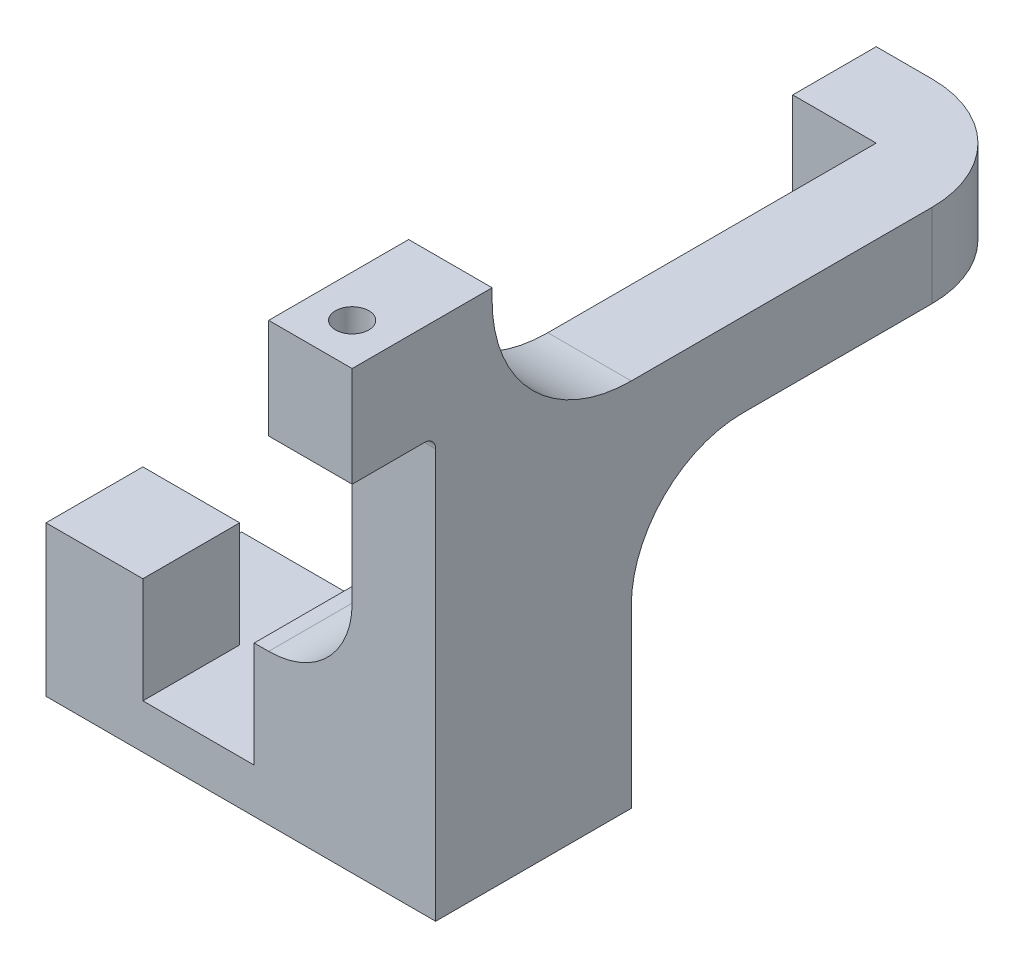
ISO-10303-21;
HEADER;
FILE_DESCRIPTION(('STEP AP214'),'2;1');
FILE_NAME('part.step','',(''),(''),'','','');
FILE_SCHEMA(('AUTOMOTIVE_DESIGN { 1 0 10303 214 1 1 1 1 }'));
ENDSEC;
DATA;
#1=APPLICATION_CONTEXT('core data for automotive mechanical design processes');
#2=APPLICATION_PROTOCOL_DEFINITION('international standard','automotive_design',2000,#1);
#3=PRODUCT_CONTEXT('',#1,'mechanical');
#4=PRODUCT('Part','Part','',(#3));
#5=PRODUCT_RELATED_PRODUCT_CATEGORY('part','',(#4));
#6=PRODUCT_DEFINITION_FORMATION('','',#4);
#7=PRODUCT_DEFINITION_CONTEXT('part definition',#1,'design');
#8=PRODUCT_DEFINITION('design','',#6,#7);
#9=PRODUCT_DEFINITION_SHAPE('','',#8);
#10=(LENGTH_UNIT() NAMED_UNIT(*) SI_UNIT(.MILLI.,.METRE.));
#11=(NAMED_UNIT(*) PLANE_ANGLE_UNIT() SI_UNIT($,.RADIAN.));
#12=(NAMED_UNIT(*) SI_UNIT($,.STERADIAN.) SOLID_ANGLE_UNIT());
#13=UNCERTAINTY_MEASURE_WITH_UNIT(LENGTH_MEASURE(1.E-05),#10,'distance_accuracy_value','');
#14=(GEOMETRIC_REPRESENTATION_CONTEXT(3) GLOBAL_UNCERTAINTY_ASSIGNED_CONTEXT((#13)) GLOBAL_UNIT_ASSIGNED_CONTEXT((#10,
#11,#12)) REPRESENTATION_CONTEXT('',''));
#15=CARTESIAN_POINT('',(0.,0.,0.));
#16=DIRECTION('',(0.,0.,1.));
#17=DIRECTION('',(1.,0.,0.));
#18=AXIS2_PLACEMENT_3D('',#15,#16,#17);
#19=CARTESIAN_POINT('',(-72.925,40.,45.0524601018634));
#20=DIRECTION('',(0.,0.,1.));
#21=DIRECTION('',(1.,0.,0.));
#22=AXIS2_PLACEMENT_3D('',#19,#20,#21);
#23=CYLINDRICAL_SURFACE('',#22,7.5);
#24=CARTESIAN_POINT('',(-65.425,40.,61.1360222652746));
#25=CARTESIAN_POINT('',(-65.4249772438871,39.8445221092474,61.2319668318376));
#26=CARTESIAN_POINT('',(-65.4298346400299,39.686339067759,61.3236216924118));
#27=CARTESIAN_POINT('',(-65.4501528101208,39.3656502932931,61.4979319972819));
#28=CARTESIAN_POINT('',(-65.4656192459043,39.2031422967066,61.5805826088811));
#29=CARTESIAN_POINT('',(-65.5079324331207,38.8755858491255,61.7361111529009));
#30=CARTESIAN_POINT('',(-65.5347425315859,38.7105472158723,61.8090195740209));
#31=CARTESIAN_POINT('',(-65.600351000794,38.3788638985895,61.9450567051029));
#32=CARTESIAN_POINT('',(-65.6391467735014,38.2122195701897,62.0081875300256));
#33=CARTESIAN_POINT('',(-65.7293371098939,37.8780884322385,62.1248164960973));
#34=CARTESIAN_POINT('',(-65.7807860976065,37.710601128866,62.1782712469318));
#35=CARTESIAN_POINT('',(-65.8963667348753,37.3771281979921,62.2753034455721));
#36=CARTESIAN_POINT('',(-65.960499551139,37.2111427101034,62.3188799839498));
#37=CARTESIAN_POINT('',(-66.1013869419035,36.8822570897864,62.3964912759389));
#38=CARTESIAN_POINT('',(-66.1781460783117,36.7193580963232,62.4305225687733));
#39=CARTESIAN_POINT('',(-66.3439519124394,36.398271088903,62.4895755265165));
#40=CARTESIAN_POINT('',(-66.4329976393504,36.2400827039432,62.5145979026893));
#41=CARTESIAN_POINT('',(-66.6194094708557,35.9354901653982,62.5556276731751));
#42=CARTESIAN_POINT('',(-66.7163532082868,35.7888666331716,62.5719307987366));
#43=CARTESIAN_POINT('',(-66.9206277090854,35.5023926490622,62.5976924454485));
#44=CARTESIAN_POINT('',(-67.0279597461105,35.3625430308571,62.6071501261048));
#45=CARTESIAN_POINT('',(-67.2524721214189,35.0904630322989,62.6201314573047));
#46=CARTESIAN_POINT('',(-67.3696627813558,34.9582408879846,62.6236488052606));
#47=CARTESIAN_POINT('',(-67.6130510302732,34.7024123799341,62.6257059483882));
#48=CARTESIAN_POINT('',(-67.7392451816666,34.5788027631369,62.6242476334456));
#49=CARTESIAN_POINT('',(-67.8696144573129,34.4598666970198,62.6207902472241));
#50=B_SPLINE_CURVE_WITH_KNOTS('',3,(#24,#25,#26,#27,#28,#29,#30,#31,#32,#33,#34,#35,#36,#37,#38,
#39,#40,#41,#42,#43,#44,#45,#46,#47,#48,#49),.UNSPECIFIED.,.F.,.F.,(4,2,2,2,2,2,2,2,2,2,2,2,4),
(0.,0.548035113739724,1.09636293080322,1.64293239307999,2.18938346304048,2.73822734665108,
3.28712173854301,3.83621488411844,4.38526466865447,4.91427257243661,5.44334541759769,
5.97297924784439,6.50241193184123),.UNSPECIFIED.);
#51=CARTESIAN_POINT('',(-67.5689286785929,34.75,62.625));
#52=VERTEX_POINT('',#51);
#53=CARTESIAN_POINT('',(-65.425,40.,61.1360222652746));
#54=VERTEX_POINT('',#53);
#55=EDGE_CURVE('E435',#52,#54,#50,.F.);
#56=ORIENTED_EDGE('',*,*,#55,.F.);
#57=CARTESIAN_POINT('',(-72.925,40.,62.625));
#58=DIRECTION('',(0.,0.,1.));
#59=DIRECTION('',(1.,0.,0.));
#60=AXIS2_PLACEMENT_3D('',#57,#58,#59);
#61=CIRCLE('',#60,7.5);
#62=CARTESIAN_POINT('',(-72.925,32.5,62.625));
#63=VERTEX_POINT('',#62);
#64=EDGE_CURVE('E67',#52,#63,#61,.F.);
#65=ORIENTED_EDGE('',*,*,#64,.T.);
#66=DIRECTION('',(0.,0.,1.));
#67=VECTOR('',#66,1.);
#68=CARTESIAN_POINT('',(-72.925,32.5,66.4975398981366));
#69=LINE('',#68,#67);
#70=CARTESIAN_POINT('',(-72.925,32.5,80.1975398981366));
#71=VERTEX_POINT('',#70);
#72=EDGE_CURVE('E433',#71,#63,#69,.F.);
#73=ORIENTED_EDGE('',*,*,#72,.F.);
#74=CARTESIAN_POINT('',(-72.925,40.,80.1975398981366));
#75=DIRECTION('',(0.,0.,1.));
#76=DIRECTION('',(1.,0.,0.));
#77=AXIS2_PLACEMENT_3D('',#74,#75,#76);
#78=CIRCLE('',#77,7.5);
#79=CARTESIAN_POINT('',(-65.425,40.,80.1975398981366));
#80=VERTEX_POINT('',#79);
#81=EDGE_CURVE('E12',#71,#80,#78,.T.);
#82=ORIENTED_EDGE('',*,*,#81,.T.);
#83=DIRECTION('',(0.,0.,1.));
#84=VECTOR('',#83,1.);
#85=CARTESIAN_POINT('',(-65.425,40.,45.0524601018634));
#86=LINE('',#85,#84);
#87=EDGE_CURVE('E430',#54,#80,#86,.T.);
#88=ORIENTED_EDGE('',*,*,#87,.F.);
#89=EDGE_LOOP('',(#56,#65,#73,#82,#88));
#90=FACE_BOUND('',#89,.T.);
#91=ADVANCED_FACE('F59',(#90),#23,.F.);
#92=CARTESIAN_POINT('',(0.,55.75,81.1975398981366));
#93=DIRECTION('',(-1.,0.,0.));
#94=DIRECTION('',(0.,0.,1.));
#95=AXIS2_PLACEMENT_3D('',#92,#93,#94);
#96=CYLINDRICAL_SURFACE('',#95,1.);
#97=DIRECTION('',(1.,0.,0.));
#98=VECTOR('',#97,1.);
#99=CARTESIAN_POINT('',(0.,56.75,81.1975398981366));
#100=LINE('',#99,#98);
#101=CARTESIAN_POINT('',(-65.425,56.75,81.1975398981366));
#102=VERTEX_POINT('',#101);
#103=CARTESIAN_POINT('',(-57.925,56.75,81.1975398981366));
#104=VERTEX_POINT('',#103);
#105=EDGE_CURVE('E235',#102,#104,#100,.T.);
#106=ORIENTED_EDGE('',*,*,#105,.F.);
#107=CARTESIAN_POINT('',(-65.425,55.75,81.1975398981366));
#108=DIRECTION('',(-1.,0.,0.));
#109=DIRECTION('',(0.,0.,1.));
#110=AXIS2_PLACEMENT_3D('',#107,#108,#109);
#111=CIRCLE('',#110,1.);
#112=CARTESIAN_POINT('',(-65.425,55.75,80.1975398981366));
#113=VERTEX_POINT('',#112);
#114=EDGE_CURVE('E425',#102,#113,#111,.T.);
#115=ORIENTED_EDGE('',*,*,#114,.T.);
#116=DIRECTION('',(1.,0.,0.));
#117=VECTOR('',#116,1.);
#118=CARTESIAN_POINT('',(0.,55.75,80.1975398981366));
#119=LINE('',#118,#117);
#120=CARTESIAN_POINT('',(-57.925,55.75,80.1975398981366));
#121=VERTEX_POINT('',#120);
#122=EDGE_CURVE('E422',#121,#113,#119,.F.);
#123=ORIENTED_EDGE('',*,*,#122,.F.);
#124=CARTESIAN_POINT('',(-57.925,55.75,81.1975398981366));
#125=DIRECTION('',(-1.,0.,0.));
#126=DIRECTION('',(0.,0.,1.));
#127=AXIS2_PLACEMENT_3D('',#124,#125,#126);
#128=CIRCLE('',#127,1.);
#129=EDGE_CURVE('E428',#121,#104,#128,.F.);
#130=ORIENTED_EDGE('',*,*,#129,.T.);
#131=EDGE_LOOP('',(#106,#115,#123,#130));
#132=FACE_BOUND('',#131,.T.);
#133=ADVANCED_FACE('F450',(#132),#96,.F.);
#134=CARTESIAN_POINT('',(-67.925,-35.9364248901641,35.625));
#135=DIRECTION('',(0.,-1.,0.));
#136=DIRECTION('',(0.,0.,-1.));
#137=AXIS2_PLACEMENT_3D('',#134,#135,#136);
#138=CYLINDRICAL_SURFACE('',#137,10.);
#139=DIRECTION('',(0.,1.,0.));
#140=VECTOR('',#139,1.);
#141=CARTESIAN_POINT('',(-57.925,-35.9364248901641,35.625));
#142=LINE('',#141,#140);
#143=CARTESIAN_POINT('',(-57.925,44.75,35.625));
#144=VERTEX_POINT('',#143);
#145=CARTESIAN_POINT('',(-57.925,52.25,35.625));
#146=VERTEX_POINT('',#145);
#147=EDGE_CURVE('E411',#144,#146,#142,.T.);
#148=ORIENTED_EDGE('',*,*,#147,.F.);
#149=CARTESIAN_POINT('',(-67.925,44.75,35.625));
#150=DIRECTION('',(0.,1.,0.));
#151=DIRECTION('',(0.,0.,1.));
#152=AXIS2_PLACEMENT_3D('',#149,#150,#151);
#153=CIRCLE('',#152,10.);
#154=CARTESIAN_POINT('',(-67.925,44.75,25.625));
#155=VERTEX_POINT('',#154);
#156=EDGE_CURVE('E417',#155,#144,#153,.F.);
#157=ORIENTED_EDGE('',*,*,#156,.F.);
#158=DIRECTION('',(0.,1.,0.));
#159=VECTOR('',#158,1.);
#160=CARTESIAN_POINT('',(-67.925,-35.9364248901641,25.625));
#161=LINE('',#160,#159);
#162=CARTESIAN_POINT('',(-67.925,52.25,25.625));
#163=VERTEX_POINT('',#162);
#164=EDGE_CURVE('E414',#163,#155,#161,.F.);
#165=ORIENTED_EDGE('',*,*,#164,.F.);
#166=CARTESIAN_POINT('',(-67.925,52.25,35.625));
#167=DIRECTION('',(0.,-1.,0.));
#168=DIRECTION('',(0.,0.,-1.));
#169=AXIS2_PLACEMENT_3D('',#166,#167,#168);
#170=CIRCLE('',#169,10.);
#171=EDGE_CURVE('E419',#146,#163,#170,.F.);
#172=ORIENTED_EDGE('',*,*,#171,.F.);
#173=EDGE_LOOP('',(#148,#157,#165,#172));
#174=FACE_BOUND('',#173,.T.);
#175=ADVANCED_FACE('F447',(#174),#138,.T.);
#176=CARTESIAN_POINT('',(0.,34.75,52.625));
#177=DIRECTION('',(-1.,0.,0.));
#178=DIRECTION('',(0.,0.,1.));
#179=AXIS2_PLACEMENT_3D('',#176,#177,#178);
#180=CYLINDRICAL_SURFACE('',#179,10.);
#181=DIRECTION('',(1.,0.,0.));
#182=VECTOR('',#181,1.);
#183=CARTESIAN_POINT('',(0.,34.75,62.625));
#184=LINE('',#183,#182);
#185=CARTESIAN_POINT('',(-57.925,34.75,62.625));
#186=VERTEX_POINT('',#185);
#187=EDGE_CURVE('E74',#52,#186,#184,.T.);
#188=ORIENTED_EDGE('',*,*,#187,.F.);
#189=ORIENTED_EDGE('',*,*,#55,.T.);
#190=CARTESIAN_POINT('',(-65.425,34.75,52.625));
#191=DIRECTION('',(-1.,0.,0.));
#192=DIRECTION('',(0.,0.,1.));
#193=AXIS2_PLACEMENT_3D('',#190,#191,#192);
#194=CIRCLE('',#193,10.);
#195=CARTESIAN_POINT('',(-65.425,44.75,52.625));
#196=VERTEX_POINT('',#195);
#197=EDGE_CURVE('E407',#54,#196,#194,.T.);
#198=ORIENTED_EDGE('',*,*,#197,.T.);
#199=DIRECTION('',(1.,0.,0.));
#200=VECTOR('',#199,1.);
#201=CARTESIAN_POINT('',(0.,44.75,52.625));
#202=LINE('',#201,#200);
#203=CARTESIAN_POINT('',(-57.925,44.75,52.625));
#204=VERTEX_POINT('',#203);
#205=EDGE_CURVE('E404',#204,#196,#202,.F.);
#206=ORIENTED_EDGE('',*,*,#205,.F.);
#207=CARTESIAN_POINT('',(-57.925,34.75,52.625));
#208=DIRECTION('',(-1.,0.,0.));
#209=DIRECTION('',(0.,0.,1.));
#210=AXIS2_PLACEMENT_3D('',#207,#208,#209);
#211=CIRCLE('',#210,10.);
#212=EDGE_CURVE('E409',#204,#186,#211,.F.);
#213=ORIENTED_EDGE('',*,*,#212,.T.);
#214=EDGE_LOOP('',(#188,#189,#198,#206,#213));
#215=FACE_BOUND('',#214,.T.);
#216=ADVANCED_FACE('F441',(#215),#180,.F.);
#217=CARTESIAN_POINT('',(0.,0.,62.625));
#218=DIRECTION('',(0.,0.,1.));
#219=DIRECTION('',(1.,0.,0.));
#220=AXIS2_PLACEMENT_3D('',#217,#218,#219);
#221=PLANE('',#220);
#222=ORIENTED_EDGE('',*,*,#64,.F.);
#223=ORIENTED_EDGE('',*,*,#187,.T.);
#224=DIRECTION('',(0.,1.,0.));
#225=VECTOR('',#224,1.);
#226=CARTESIAN_POINT('',(-57.925,-35.9364248901641,62.625));
#227=LINE('',#226,#225);
#228=CARTESIAN_POINT('',(-57.925,19.,62.625));
#229=VERTEX_POINT('',#228);
#230=EDGE_CURVE('E339',#229,#186,#227,.T.);
#231=ORIENTED_EDGE('',*,*,#230,.F.);
#232=DIRECTION('',(1.,0.,0.));
#233=VECTOR('',#232,1.);
#234=CARTESIAN_POINT('',(-92.925,19.,62.625));
#235=LINE('',#234,#233);
#236=CARTESIAN_POINT('',(-92.925,19.,62.625));
#237=VERTEX_POINT('',#236);
#238=EDGE_CURVE('E336',#237,#229,#235,.T.);
#239=ORIENTED_EDGE('',*,*,#238,.F.);
#240=DIRECTION('',(0.,-1.,0.));
#241=VECTOR('',#240,1.);
#242=CARTESIAN_POINT('',(-92.925,0.,62.625));
#243=LINE('',#242,#241);
#244=CARTESIAN_POINT('',(-92.925,23.,62.625));
#245=VERTEX_POINT('',#244);
#246=EDGE_CURVE('E333',#245,#237,#243,.T.);
#247=ORIENTED_EDGE('',*,*,#246,.F.);
#248=DIRECTION('',(1.,0.,0.));
#249=VECTOR('',#248,1.);
#250=CARTESIAN_POINT('',(0.,23.,62.625));
#251=LINE('',#250,#249);
#252=CARTESIAN_POINT('',(-76.062179306799,23.,62.625));
#253=VERTEX_POINT('',#252);
#254=EDGE_CURVE('E331',#245,#253,#251,.T.);
#255=ORIENTED_EDGE('',*,*,#254,.T.);
#256=DIRECTION('',(0.,1.,0.));
#257=VECTOR('',#256,1.);
#258=CARTESIAN_POINT('',(-76.062179306799,23.,62.625));
#259=LINE('',#258,#257);
#260=CARTESIAN_POINT('',(-76.062179306799,32.5,62.625));
#261=VERTEX_POINT('',#260);
#262=EDGE_CURVE('E398',#261,#253,#259,.F.);
#263=ORIENTED_EDGE('',*,*,#262,.F.);
#264=DIRECTION('',(-1.,0.,0.));
#265=VECTOR('',#264,1.);
#266=CARTESIAN_POINT('',(-65.525,32.5,62.625));
#267=LINE('',#266,#265);
#268=EDGE_CURVE('E329',#63,#261,#267,.T.);
#269=ORIENTED_EDGE('',*,*,#268,.F.);
#270=EDGE_LOOP('',(#222,#223,#231,#239,#247,#255,#263,#269));
#271=FACE_BOUND('',#270,.T.);
#272=ADVANCED_FACE('F446',(#271),#221,.F.);
#273=CARTESIAN_POINT('',(-65.425,-35.9364248901641,45.0524601018634));
#274=DIRECTION('',(-1.,0.,0.));
#275=DIRECTION('',(0.,0.,1.));
#276=AXIS2_PLACEMENT_3D('',#273,#274,#275);
#277=PLANE('',#276);
#278=ORIENTED_EDGE('',*,*,#197,.F.);
#279=ORIENTED_EDGE('',*,*,#87,.T.);
#280=DIRECTION('',(0.,1.,0.));
#281=VECTOR('',#280,1.);
#282=CARTESIAN_POINT('',(-65.425,-35.9364248901641,80.1975398981366));
#283=LINE('',#282,#281);
#284=EDGE_CURVE('E390',#80,#113,#283,.T.);
#285=ORIENTED_EDGE('',*,*,#284,.T.);
#286=ORIENTED_EDGE('',*,*,#114,.F.);
#287=DIRECTION('',(0.,0.,-1.));
#288=VECTOR('',#287,1.);
#289=CARTESIAN_POINT('',(-65.425,56.75,87.6975398981366));
#290=LINE('',#289,#288);
#291=CARTESIAN_POINT('',(-65.425,56.75,87.6975398981366));
#292=VERTEX_POINT('',#291);
#293=EDGE_CURVE('E237',#292,#102,#290,.T.);
#294=ORIENTED_EDGE('',*,*,#293,.F.);
#295=DIRECTION('',(0.,1.,0.));
#296=VECTOR('',#295,1.);
#297=CARTESIAN_POINT('',(-65.425,58.75,87.6975398981366));
#298=LINE('',#297,#296);
#299=CARTESIAN_POINT('',(-65.425,65.75,87.6975398981366));
#300=VERTEX_POINT('',#299);
#301=EDGE_CURVE('E249',#292,#300,#298,.T.);
#302=ORIENTED_EDGE('',*,*,#301,.T.);
#303=DIRECTION('',(0.,0.,1.));
#304=VECTOR('',#303,1.);
#305=CARTESIAN_POINT('',(-65.425,65.75,0.));
#306=LINE('',#305,#304);
#307=CARTESIAN_POINT('',(-65.425,65.75,75.125));
#308=VERTEX_POINT('',#307);
#309=EDGE_CURVE('E263',#308,#300,#306,.T.);
#310=ORIENTED_EDGE('',*,*,#309,.F.);
#311=DIRECTION('',(0.,-1.,0.));
#312=VECTOR('',#311,1.);
#313=CARTESIAN_POINT('',(-65.425,65.75,75.125));
#314=LINE('',#313,#312);
#315=CARTESIAN_POINT('',(-65.425,64.75,75.125));
#316=VERTEX_POINT('',#315);
#317=EDGE_CURVE('E266',#308,#316,#314,.T.);
#318=ORIENTED_EDGE('',*,*,#317,.T.);
#319=CARTESIAN_POINT('',(-65.425,64.75,62.625));
#320=DIRECTION('',(-1.,0.,0.));
#321=DIRECTION('',(0.,0.,1.));
#322=AXIS2_PLACEMENT_3D('',#319,#320,#321);
#323=CIRCLE('',#322,12.5);
#324=CARTESIAN_POINT('',(-65.425,52.25,62.625));
#325=VERTEX_POINT('',#324);
#326=EDGE_CURVE('E387',#316,#325,#323,.F.);
#327=ORIENTED_EDGE('',*,*,#326,.T.);
#328=DIRECTION('',(0.,0.,1.));
#329=VECTOR('',#328,1.);
#330=CARTESIAN_POINT('',(-65.425,52.25,33.125));
#331=LINE('',#330,#329);
#332=CARTESIAN_POINT('',(-65.425,52.25,33.125));
#333=VERTEX_POINT('',#332);
#334=EDGE_CURVE('E299',#333,#325,#331,.T.);
#335=ORIENTED_EDGE('',*,*,#334,.F.);
#336=DIRECTION('',(0.,1.,0.));
#337=VECTOR('',#336,1.);
#338=CARTESIAN_POINT('',(-65.425,0.,33.125));
#339=LINE('',#338,#337);
#340=CARTESIAN_POINT('',(-65.425,44.75,33.125));
#341=VERTEX_POINT('',#340);
#342=EDGE_CURVE('E287',#341,#333,#339,.T.);
#343=ORIENTED_EDGE('',*,*,#342,.F.);
#344=DIRECTION('',(0.,0.,1.));
#345=VECTOR('',#344,1.);
#346=CARTESIAN_POINT('',(-65.425,44.75,33.125));
#347=LINE('',#346,#345);
#348=EDGE_CURVE('E298',#341,#196,#347,.T.);
#349=ORIENTED_EDGE('',*,*,#348,.T.);
#350=EDGE_LOOP('',(#278,#279,#285,#286,#294,#302,#310,#318,#327,#335,#343,#349));
#351=FACE_BOUND('',#350,.T.);
#352=ADVANCED_FACE('F511',(#351),#277,.T.);
#353=CARTESIAN_POINT('',(-65.425,-35.9364248901641,80.1975398981366));
#354=DIRECTION('',(0.,0.,1.));
#355=DIRECTION('',(1.,0.,0.));
#356=AXIS2_PLACEMENT_3D('',#353,#354,#355);
#357=PLANE('',#356);
#358=DIRECTION('',(0.,1.,0.));
#359=VECTOR('',#358,1.);
#360=CARTESIAN_POINT('',(-57.925,-35.9364248901641,80.1975398981366));
#361=LINE('',#360,#359);
#362=CARTESIAN_POINT('',(-57.925,19.,80.1975398981366));
#363=VERTEX_POINT('',#362);
#364=EDGE_CURVE('E391',#363,#121,#361,.T.);
#365=ORIENTED_EDGE('',*,*,#364,.T.);
#366=ORIENTED_EDGE('',*,*,#122,.T.);
#367=ORIENTED_EDGE('',*,*,#284,.F.);
#368=ORIENTED_EDGE('',*,*,#81,.F.);
#369=DIRECTION('',(1.,0.,0.));
#370=VECTOR('',#369,1.);
#371=CARTESIAN_POINT('',(-74.225,32.5,80.1975398981366));
#372=LINE('',#371,#370);
#373=CARTESIAN_POINT('',(-74.225,32.5,80.1975398981366));
#374=VERTEX_POINT('',#373);
#375=EDGE_CURVE('E326',#374,#71,#372,.T.);
#376=ORIENTED_EDGE('',*,*,#375,.F.);
#377=DIRECTION('',(0.,1.,0.));
#378=VECTOR('',#377,1.);
#379=CARTESIAN_POINT('',(-74.225,23.,80.1975398981366));
#380=LINE('',#379,#378);
#381=CARTESIAN_POINT('',(-74.225,23.,80.1975398981366));
#382=VERTEX_POINT('',#381);
#383=EDGE_CURVE('E366',#382,#374,#380,.T.);
#384=ORIENTED_EDGE('',*,*,#383,.F.);
#385=DIRECTION('',(1.,0.,0.));
#386=VECTOR('',#385,1.);
#387=CARTESIAN_POINT('',(0.,23.,80.1975398981366));
#388=LINE('',#387,#386);
#389=CARTESIAN_POINT('',(-84.225,23.,80.1975398981366));
#390=VERTEX_POINT('',#389);
#391=EDGE_CURVE('E358',#390,#382,#388,.T.);
#392=ORIENTED_EDGE('',*,*,#391,.F.);
#393=DIRECTION('',(0.,1.,0.));
#394=VECTOR('',#393,1.);
#395=CARTESIAN_POINT('',(-84.225,23.,80.1975398981366));
#396=LINE('',#395,#394);
#397=CARTESIAN_POINT('',(-84.225,32.5,80.1975398981366));
#398=VERTEX_POINT('',#397);
#399=EDGE_CURVE('E368',#390,#398,#396,.T.);
#400=ORIENTED_EDGE('',*,*,#399,.T.);
#401=DIRECTION('',(1.,0.,0.));
#402=VECTOR('',#401,1.);
#403=CARTESIAN_POINT('',(-92.925,32.5,80.1975398981366));
#404=LINE('',#403,#402);
#405=CARTESIAN_POINT('',(-92.925,32.5,80.1975398981366));
#406=VERTEX_POINT('',#405);
#407=EDGE_CURVE('E311',#406,#398,#404,.T.);
#408=ORIENTED_EDGE('',*,*,#407,.F.);
#409=DIRECTION('',(0.,1.,0.));
#410=VECTOR('',#409,1.);
#411=CARTESIAN_POINT('',(-92.925,0.,80.1975398981366));
#412=LINE('',#411,#410);
#413=CARTESIAN_POINT('',(-92.925,19.,80.1975398981366));
#414=VERTEX_POINT('',#413);
#415=EDGE_CURVE('E376',#414,#406,#412,.T.);
#416=ORIENTED_EDGE('',*,*,#415,.F.);
#417=DIRECTION('',(1.,0.,0.));
#418=VECTOR('',#417,1.);
#419=CARTESIAN_POINT('',(-92.925,19.,80.1975398981366));
#420=LINE('',#419,#418);
#421=EDGE_CURVE('E380',#414,#363,#420,.T.);
#422=ORIENTED_EDGE('',*,*,#421,.T.);
#423=EDGE_LOOP('',(#365,#366,#367,#368,#376,#384,#392,#400,#408,#416,#422));
#424=FACE_BOUND('',#423,.T.);
#425=ADVANCED_FACE('F551',(#424),#357,.T.);
#426=CARTESIAN_POINT('',(-70.425,64.75,62.625));
#427=DIRECTION('',(1.,0.,0.));
#428=DIRECTION('',(0.,0.,-1.));
#429=AXIS2_PLACEMENT_3D('',#426,#427,#428);
#430=CYLINDRICAL_SURFACE('',#429,12.5);
#431=DIRECTION('',(1.,0.,0.));
#432=VECTOR('',#431,1.);
#433=CARTESIAN_POINT('',(-70.425,52.25,62.625));
#434=LINE('',#433,#432);
#435=CARTESIAN_POINT('',(-57.925,52.25,62.625));
#436=VERTEX_POINT('',#435);
#437=EDGE_CURVE('E342',#325,#436,#434,.T.);
#438=ORIENTED_EDGE('',*,*,#437,.F.);
#439=ORIENTED_EDGE('',*,*,#326,.F.);
#440=DIRECTION('',(1.,0.,0.));
#441=VECTOR('',#440,1.);
#442=CARTESIAN_POINT('',(-70.425,64.75,75.125));
#443=LINE('',#442,#441);
#444=CARTESIAN_POINT('',(-57.925,64.75,75.125));
#445=VERTEX_POINT('',#444);
#446=EDGE_CURVE('E394',#316,#445,#443,.T.);
#447=ORIENTED_EDGE('',*,*,#446,.T.);
#448=CARTESIAN_POINT('',(-57.925,64.75,62.625));
#449=DIRECTION('',(-1.,0.,0.));
#450=DIRECTION('',(0.,0.,1.));
#451=AXIS2_PLACEMENT_3D('',#448,#449,#450);
#452=CIRCLE('',#451,12.5);
#453=EDGE_CURVE('E384',#436,#445,#452,.T.);
#454=ORIENTED_EDGE('',*,*,#453,.F.);
#455=EDGE_LOOP('',(#438,#439,#447,#454));
#456=FACE_BOUND('',#455,.T.);
#457=ADVANCED_FACE('F548',(#456),#430,.F.);
#458=CARTESIAN_POINT('',(-57.925,-35.9364248901641,45.0524601018634));
#459=DIRECTION('',(-1.,0.,0.));
#460=DIRECTION('',(0.,0.,1.));
#461=AXIS2_PLACEMENT_3D('',#458,#459,#460);
#462=PLANE('',#461);
#463=DIRECTION('',(0.,0.,1.));
#464=VECTOR('',#463,1.);
#465=CARTESIAN_POINT('',(-57.925,44.75,33.125));
#466=LINE('',#465,#464);
#467=EDGE_CURVE('E305',#144,#204,#466,.T.);
#468=ORIENTED_EDGE('',*,*,#467,.F.);
#469=ORIENTED_EDGE('',*,*,#147,.T.);
#470=DIRECTION('',(0.,0.,1.));
#471=VECTOR('',#470,1.);
#472=CARTESIAN_POINT('',(-57.925,52.25,33.125));
#473=LINE('',#472,#471);
#474=EDGE_CURVE('E303',#146,#436,#473,.T.);
#475=ORIENTED_EDGE('',*,*,#474,.T.);
#476=ORIENTED_EDGE('',*,*,#453,.T.);
#477=DIRECTION('',(0.,-1.,0.));
#478=VECTOR('',#477,1.);
#479=CARTESIAN_POINT('',(-57.925,65.75,75.125));
#480=LINE('',#479,#478);
#481=CARTESIAN_POINT('',(-57.925,65.75,75.125));
#482=VERTEX_POINT('',#481);
#483=EDGE_CURVE('E269',#482,#445,#480,.T.);
#484=ORIENTED_EDGE('',*,*,#483,.F.);
#485=DIRECTION('',(0.,0.,-1.));
#486=VECTOR('',#485,1.);
#487=CARTESIAN_POINT('',(-57.925,65.75,0.));
#488=LINE('',#487,#486);
#489=CARTESIAN_POINT('',(-57.925,65.75,87.6975398981366));
#490=VERTEX_POINT('',#489);
#491=EDGE_CURVE('E244',#490,#482,#488,.T.);
#492=ORIENTED_EDGE('',*,*,#491,.F.);
#493=DIRECTION('',(0.,1.,0.));
#494=VECTOR('',#493,1.);
#495=CARTESIAN_POINT('',(-57.925,58.75,87.6975398981366));
#496=LINE('',#495,#494);
#497=CARTESIAN_POINT('',(-57.925,56.75,87.6975398981366));
#498=VERTEX_POINT('',#497);
#499=EDGE_CURVE('E240',#498,#490,#496,.T.);
#500=ORIENTED_EDGE('',*,*,#499,.F.);
#501=DIRECTION('',(0.,0.,1.));
#502=VECTOR('',#501,1.);
#503=CARTESIAN_POINT('',(-57.925,56.75,87.6975398981366));
#504=LINE('',#503,#502);
#505=EDGE_CURVE('E226',#104,#498,#504,.T.);
#506=ORIENTED_EDGE('',*,*,#505,.F.);
#507=ORIENTED_EDGE('',*,*,#129,.F.);
#508=ORIENTED_EDGE('',*,*,#364,.F.);
#509=DIRECTION('',(0.,0.,1.));
#510=VECTOR('',#509,1.);
#511=CARTESIAN_POINT('',(-57.925,19.,0.));
#512=LINE('',#511,#510);
#513=EDGE_CURVE('E248',#229,#363,#512,.T.);
#514=ORIENTED_EDGE('',*,*,#513,.F.);
#515=ORIENTED_EDGE('',*,*,#230,.T.);
#516=ORIENTED_EDGE('',*,*,#212,.F.);
#517=EDGE_LOOP('',(#468,#469,#475,#476,#484,#492,#500,#506,#507,#508,#514,#515,#516));
#518=FACE_BOUND('',#517,.T.);
#519=ADVANCED_FACE('F242',(#518),#462,.F.);
#520=CARTESIAN_POINT('',(-92.925,19.,0.));
#521=DIRECTION('',(0.,1.,0.));
#522=DIRECTION('',(0.,0.,1.));
#523=AXIS2_PLACEMENT_3D('',#520,#521,#522);
#524=PLANE('',#523);
#525=CARTESIAN_POINT('',(-79.225,19.,66.4975398981366));
#526=DIRECTION('',(0.,1.,0.));
#527=DIRECTION('',(0.,0.,1.));
#528=AXIS2_PLACEMENT_3D('',#525,#526,#527);
#529=CIRCLE('',#528,1.5);
#530=CARTESIAN_POINT('',(-79.225,19.,67.9975398981366));
#531=VERTEX_POINT('',#530);
#532=EDGE_CURVE('E345',#531,#531,#529,.T.);
#533=ORIENTED_EDGE('',*,*,#532,.T.);
#534=EDGE_LOOP('',(#533));
#535=FACE_BOUND('',#534,.T.);
#536=DIRECTION('',(0.,0.,1.));
#537=VECTOR('',#536,1.);
#538=CARTESIAN_POINT('',(-92.925,19.,0.));
#539=LINE('',#538,#537);
#540=EDGE_CURVE('E378',#237,#414,#539,.T.);
#541=ORIENTED_EDGE('',*,*,#540,.F.);
#542=ORIENTED_EDGE('',*,*,#238,.T.);
#543=ORIENTED_EDGE('',*,*,#513,.T.);
#544=ORIENTED_EDGE('',*,*,#421,.F.);
#545=EDGE_LOOP('',(#541,#542,#543,#544));
#546=FACE_BOUND('',#545,.T.);
#547=ADVANCED_FACE('F543',(#535,#546),#524,.F.);
#548=CARTESIAN_POINT('',(-92.925,0.,0.));
#549=DIRECTION('',(1.,0.,0.));
#550=DIRECTION('',(0.,0.,-1.));
#551=AXIS2_PLACEMENT_3D('',#548,#549,#550);
#552=PLANE('',#551);
#553=DIRECTION('',(0.,0.,1.));
#554=VECTOR('',#553,1.);
#555=CARTESIAN_POINT('',(-92.925,23.,0.));
#556=LINE('',#555,#554);
#557=CARTESIAN_POINT('',(-92.925,23.,71.4975398981366));
#558=VERTEX_POINT('',#557);
#559=EDGE_CURVE('E349',#245,#558,#556,.T.);
#560=ORIENTED_EDGE('',*,*,#559,.F.);
#561=ORIENTED_EDGE('',*,*,#246,.T.);
#562=ORIENTED_EDGE('',*,*,#540,.T.);
#563=ORIENTED_EDGE('',*,*,#415,.T.);
#564=DIRECTION('',(0.,0.,1.));
#565=VECTOR('',#564,1.);
#566=CARTESIAN_POINT('',(-92.925,32.5,80.1975398981366));
#567=LINE('',#566,#565);
#568=CARTESIAN_POINT('',(-92.925,32.5,71.4975398981366));
#569=VERTEX_POINT('',#568);
#570=EDGE_CURVE('E302',#569,#406,#567,.T.);
#571=ORIENTED_EDGE('',*,*,#570,.F.);
#572=DIRECTION('',(0.,1.,0.));
#573=VECTOR('',#572,1.);
#574=CARTESIAN_POINT('',(-92.925,23.,71.4975398981366));
#575=LINE('',#574,#573);
#576=EDGE_CURVE('E363',#558,#569,#575,.T.);
#577=ORIENTED_EDGE('',*,*,#576,.F.);
#578=EDGE_LOOP('',(#560,#561,#562,#563,#571,#577));
#579=FACE_BOUND('',#578,.T.);
#580=ADVANCED_FACE('F538',(#579),#552,.F.);
#581=CARTESIAN_POINT('',(0.,58.75,87.6975398981366));
#582=DIRECTION('',(0.,0.,-1.));
#583=DIRECTION('',(-1.,0.,0.));
#584=AXIS2_PLACEMENT_3D('',#581,#582,#583);
#585=PLANE('',#584);
#586=ORIENTED_EDGE('',*,*,#499,.T.);
#587=DIRECTION('',(1.,0.,0.));
#588=VECTOR('',#587,1.);
#589=CARTESIAN_POINT('',(0.,65.75,87.6975398981366));
#590=LINE('',#589,#588);
#591=EDGE_CURVE('E255',#300,#490,#590,.T.);
#592=ORIENTED_EDGE('',*,*,#591,.F.);
#593=ORIENTED_EDGE('',*,*,#301,.F.);
#594=DIRECTION('',(-1.,0.,0.));
#595=VECTOR('',#594,1.);
#596=CARTESIAN_POINT('',(-65.425,56.75,87.6975398981366));
#597=LINE('',#596,#595);
#598=EDGE_CURVE('E232',#498,#292,#597,.T.);
#599=ORIENTED_EDGE('',*,*,#598,.F.);
#600=EDGE_LOOP('',(#586,#592,#593,#599));
#601=FACE_BOUND('',#600,.T.);
#602=ADVANCED_FACE('F251',(#601),#585,.F.);
#603=CARTESIAN_POINT('',(-61.675,58.75,83.9475398981366));
#604=DIRECTION('',(0.,1.,0.));
#605=DIRECTION('',(0.,0.,1.));
#606=AXIS2_PLACEMENT_3D('',#603,#604,#605);
#607=CYLINDRICAL_SURFACE('',#606,1.5);
#608=CARTESIAN_POINT('',(-61.675,65.75,83.9475398981366));
#609=DIRECTION('',(0.,1.,0.));
#610=DIRECTION('',(0.,0.,1.));
#611=AXIS2_PLACEMENT_3D('',#608,#609,#610);
#612=CIRCLE('',#611,1.5);
#613=CARTESIAN_POINT('',(-61.675,65.75,85.4475398981366));
#614=VERTEX_POINT('',#613);
#615=EDGE_CURVE('E252',#614,#614,#612,.F.);
#616=ORIENTED_EDGE('',*,*,#615,.F.);
#617=EDGE_LOOP('',(#616));
#618=FACE_BOUND('',#617,.T.);
#619=CARTESIAN_POINT('',(-61.675,56.75,83.9475398981366));
#620=DIRECTION('',(0.,-1.,0.));
#621=DIRECTION('',(0.,0.,-1.));
#622=AXIS2_PLACEMENT_3D('',#619,#620,#621);
#623=CIRCLE('',#622,1.5);
#624=CARTESIAN_POINT('',(-61.675,56.75,82.4475398981366));
#625=VERTEX_POINT('',#624);
#626=EDGE_CURVE('E461',#625,#625,#623,.T.);
#627=ORIENTED_EDGE('',*,*,#626,.T.);
#628=EDGE_LOOP('',(#627));
#629=FACE_BOUND('',#628,.T.);
#630=ADVANCED_FACE('F466',(#618,#629),#607,.F.);
#631=CARTESIAN_POINT('',(-74.225,23.,0.));
#632=DIRECTION('',(1.,0.,0.));
#633=DIRECTION('',(0.,0.,-1.));
#634=AXIS2_PLACEMENT_3D('',#631,#632,#633);
#635=PLANE('',#634);
#636=ORIENTED_EDGE('',*,*,#383,.T.);
#637=DIRECTION('',(0.,0.,1.));
#638=VECTOR('',#637,1.);
#639=CARTESIAN_POINT('',(-74.225,32.5,66.4975398981366));
#640=LINE('',#639,#638);
#641=CARTESIAN_POINT('',(-74.225,32.5,66.4975398981366));
#642=VERTEX_POINT('',#641);
#643=EDGE_CURVE('E323',#642,#374,#640,.T.);
#644=ORIENTED_EDGE('',*,*,#643,.F.);
#645=DIRECTION('',(0.,1.,0.));
#646=VECTOR('',#645,1.);
#647=CARTESIAN_POINT('',(-74.225,23.,66.4975398981366));
#648=LINE('',#647,#646);
#649=CARTESIAN_POINT('',(-74.225,23.,66.4975398981366));
#650=VERTEX_POINT('',#649);
#651=EDGE_CURVE('E364',#650,#642,#648,.T.);
#652=ORIENTED_EDGE('',*,*,#651,.F.);
#653=DIRECTION('',(0.,0.,-1.));
#654=VECTOR('',#653,1.);
#655=CARTESIAN_POINT('',(-74.225,23.,0.));
#656=LINE('',#655,#654);
#657=EDGE_CURVE('E360',#382,#650,#656,.T.);
#658=ORIENTED_EDGE('',*,*,#657,.F.);
#659=EDGE_LOOP('',(#636,#644,#652,#658));
#660=FACE_BOUND('',#659,.T.);
#661=ADVANCED_FACE('F522',(#660),#635,.F.);
#662=CARTESIAN_POINT('',(-84.225,23.,0.));
#663=DIRECTION('',(-1.,0.,0.));
#664=DIRECTION('',(0.,0.,1.));
#665=AXIS2_PLACEMENT_3D('',#662,#663,#664);
#666=PLANE('',#665);
#667=DIRECTION('',(0.,1.,0.));
#668=VECTOR('',#667,1.);
#669=CARTESIAN_POINT('',(-84.225,23.,71.4975398981366));
#670=LINE('',#669,#668);
#671=CARTESIAN_POINT('',(-84.225,23.,71.4975398981366));
#672=VERTEX_POINT('',#671);
#673=CARTESIAN_POINT('',(-84.225,32.5,71.4975398981366));
#674=VERTEX_POINT('',#673);
#675=EDGE_CURVE('E370',#672,#674,#670,.T.);
#676=ORIENTED_EDGE('',*,*,#675,.T.);
#677=DIRECTION('',(0.,0.,-1.));
#678=VECTOR('',#677,1.);
#679=CARTESIAN_POINT('',(-84.225,32.5,80.1975398981366));
#680=LINE('',#679,#678);
#681=EDGE_CURVE('E314',#398,#674,#680,.T.);
#682=ORIENTED_EDGE('',*,*,#681,.F.);
#683=ORIENTED_EDGE('',*,*,#399,.F.);
#684=DIRECTION('',(0.,0.,1.));
#685=VECTOR('',#684,1.);
#686=CARTESIAN_POINT('',(-84.225,23.,0.));
#687=LINE('',#686,#685);
#688=EDGE_CURVE('E355',#672,#390,#687,.T.);
#689=ORIENTED_EDGE('',*,*,#688,.F.);
#690=EDGE_LOOP('',(#676,#682,#683,#689));
#691=FACE_BOUND('',#690,.T.);
#692=ADVANCED_FACE('F525',(#691),#666,.F.);
#693=CARTESIAN_POINT('',(0.,23.,71.4975398981366));
#694=DIRECTION('',(0.,0.,1.));
#695=DIRECTION('',(1.,0.,0.));
#696=AXIS2_PLACEMENT_3D('',#693,#694,#695);
#697=PLANE('',#696);
#698=ORIENTED_EDGE('',*,*,#576,.T.);
#699=DIRECTION('',(-1.,0.,0.));
#700=VECTOR('',#699,1.);
#701=CARTESIAN_POINT('',(-92.925,32.5,71.4975398981366));
#702=LINE('',#701,#700);
#703=EDGE_CURVE('E317',#674,#569,#702,.T.);
#704=ORIENTED_EDGE('',*,*,#703,.F.);
#705=ORIENTED_EDGE('',*,*,#675,.F.);
#706=DIRECTION('',(1.,0.,0.));
#707=VECTOR('',#706,1.);
#708=CARTESIAN_POINT('',(0.,23.,71.4975398981366));
#709=LINE('',#708,#707);
#710=EDGE_CURVE('E351',#558,#672,#709,.T.);
#711=ORIENTED_EDGE('',*,*,#710,.F.);
#712=EDGE_LOOP('',(#698,#704,#705,#711));
#713=FACE_BOUND('',#712,.T.);
#714=ADVANCED_FACE('F520',(#713),#697,.F.);
#715=CARTESIAN_POINT('',(0.,23.,0.));
#716=DIRECTION('',(0.,1.,0.));
#717=DIRECTION('',(0.,0.,1.));
#718=AXIS2_PLACEMENT_3D('',#715,#716,#717);
#719=PLANE('',#718);
#720=ORIENTED_EDGE('',*,*,#254,.F.);
#721=ORIENTED_EDGE('',*,*,#559,.T.);
#722=ORIENTED_EDGE('',*,*,#710,.T.);
#723=ORIENTED_EDGE('',*,*,#688,.T.);
#724=ORIENTED_EDGE('',*,*,#391,.T.);
#725=ORIENTED_EDGE('',*,*,#657,.T.);
#726=CARTESIAN_POINT('',(-79.225,23.,66.4975398981366));
#727=DIRECTION('',(0.,1.,0.));
#728=DIRECTION('',(0.,0.,1.));
#729=AXIS2_PLACEMENT_3D('',#726,#727,#728);
#730=CIRCLE('',#729,5.00000000000001);
#731=EDGE_CURVE('E352',#650,#253,#730,.T.);
#732=ORIENTED_EDGE('',*,*,#731,.T.);
#733=EDGE_LOOP('',(#720,#721,#722,#723,#724,#725,#732));
#734=FACE_BOUND('',#733,.T.);
#735=CARTESIAN_POINT('',(-79.225,23.,66.4975398981366));
#736=DIRECTION('',(0.,1.,0.));
#737=DIRECTION('',(0.,0.,1.));
#738=AXIS2_PLACEMENT_3D('',#735,#736,#737);
#739=CIRCLE('',#738,1.5);
#740=CARTESIAN_POINT('',(-79.225,23.,67.9975398981366));
#741=VERTEX_POINT('',#740);
#742=EDGE_CURVE('E348',#741,#741,#739,.T.);
#743=ORIENTED_EDGE('',*,*,#742,.F.);
#744=EDGE_LOOP('',(#743));
#745=FACE_BOUND('',#744,.T.);
#746=ADVANCED_FACE('F517',(#734,#745),#719,.T.);
#747=CARTESIAN_POINT('',(-79.225,23.,66.4975398981366));
#748=DIRECTION('',(0.,1.,0.));
#749=DIRECTION('',(0.,0.,1.));
#750=AXIS2_PLACEMENT_3D('',#747,#748,#749);
#751=CYLINDRICAL_SURFACE('',#750,5.00000000000001);
#752=ORIENTED_EDGE('',*,*,#651,.T.);
#753=CARTESIAN_POINT('',(-79.225,32.5,66.4975398981366));
#754=DIRECTION('',(0.,-1.,0.));
#755=DIRECTION('',(0.,0.,-1.));
#756=AXIS2_PLACEMENT_3D('',#753,#754,#755);
#757=CIRCLE('',#756,4.99999999999998);
#758=EDGE_CURVE('E320',#261,#642,#757,.T.);
#759=ORIENTED_EDGE('',*,*,#758,.F.);
#760=ORIENTED_EDGE('',*,*,#262,.T.);
#761=ORIENTED_EDGE('',*,*,#731,.F.);
#762=EDGE_LOOP('',(#752,#759,#760,#761));
#763=FACE_BOUND('',#762,.T.);
#764=ADVANCED_FACE('F515',(#763),#751,.F.);
#765=CARTESIAN_POINT('',(-79.225,19.,66.4975398981366));
#766=DIRECTION('',(0.,1.,0.));
#767=DIRECTION('',(0.,0.,1.));
#768=AXIS2_PLACEMENT_3D('',#765,#766,#767);
#769=CYLINDRICAL_SURFACE('',#768,1.5);
#770=ORIENTED_EDGE('',*,*,#742,.T.);
#771=EDGE_LOOP('',(#770));
#772=FACE_BOUND('',#771,.T.);
#773=ORIENTED_EDGE('',*,*,#532,.F.);
#774=EDGE_LOOP('',(#773));
#775=FACE_BOUND('',#774,.T.);
#776=ADVANCED_FACE('F507',(#772,#775),#769,.F.);
#777=CARTESIAN_POINT('',(-79.225,32.5,66.4975398981366));
#778=DIRECTION('',(0.,-1.,0.));
#779=DIRECTION('',(0.,0.,-1.));
#780=AXIS2_PLACEMENT_3D('',#777,#778,#779);
#781=PLANE('',#780);
#782=ORIENTED_EDGE('',*,*,#375,.T.);
#783=ORIENTED_EDGE('',*,*,#72,.T.);
#784=ORIENTED_EDGE('',*,*,#268,.T.);
#785=ORIENTED_EDGE('',*,*,#758,.T.);
#786=ORIENTED_EDGE('',*,*,#643,.T.);
#787=EDGE_LOOP('',(#782,#783,#784,#785,#786));
#788=FACE_BOUND('',#787,.T.);
#789=ADVANCED_FACE('F503',(#788),#781,.F.);
#790=CARTESIAN_POINT('',(0.,32.5,0.));
#791=DIRECTION('',(0.,-1.,0.));
#792=DIRECTION('',(0.,0.,-1.));
#793=AXIS2_PLACEMENT_3D('',#790,#791,#792);
#794=PLANE('',#793);
#795=ORIENTED_EDGE('',*,*,#570,.T.);
#796=ORIENTED_EDGE('',*,*,#407,.T.);
#797=ORIENTED_EDGE('',*,*,#681,.T.);
#798=ORIENTED_EDGE('',*,*,#703,.T.);
#799=EDGE_LOOP('',(#795,#796,#797,#798));
#800=FACE_BOUND('',#799,.T.);
#801=ADVANCED_FACE('F496',(#800),#794,.F.);
#802=CARTESIAN_POINT('',(0.,52.25,33.125));
#803=DIRECTION('',(0.,-1.,0.));
#804=DIRECTION('',(0.,0.,-1.));
#805=AXIS2_PLACEMENT_3D('',#802,#803,#804);
#806=PLANE('',#805);
#807=ORIENTED_EDGE('',*,*,#474,.F.);
#808=ORIENTED_EDGE('',*,*,#171,.T.);
#809=DIRECTION('',(1.,0.,0.));
#810=VECTOR('',#809,1.);
#811=CARTESIAN_POINT('',(-72.925,52.25,25.625));
#812=LINE('',#811,#810);
#813=CARTESIAN_POINT('',(-72.925,52.25,25.625));
#814=VERTEX_POINT('',#813);
#815=EDGE_CURVE('E288',#814,#163,#812,.T.);
#816=ORIENTED_EDGE('',*,*,#815,.F.);
#817=DIRECTION('',(0.,0.,1.));
#818=VECTOR('',#817,1.);
#819=CARTESIAN_POINT('',(-72.925,52.25,33.125));
#820=LINE('',#819,#818);
#821=CARTESIAN_POINT('',(-72.925,52.25,33.125));
#822=VERTEX_POINT('',#821);
#823=EDGE_CURVE('E280',#814,#822,#820,.T.);
#824=ORIENTED_EDGE('',*,*,#823,.T.);
#825=DIRECTION('',(1.,0.,0.));
#826=VECTOR('',#825,1.);
#827=CARTESIAN_POINT('',(-72.925,52.25,33.125));
#828=LINE('',#827,#826);
#829=EDGE_CURVE('E284',#822,#333,#828,.T.);
#830=ORIENTED_EDGE('',*,*,#829,.T.);
#831=ORIENTED_EDGE('',*,*,#334,.T.);
#832=ORIENTED_EDGE('',*,*,#437,.T.);
#833=EDGE_LOOP('',(#807,#808,#816,#824,#830,#831,#832));
#834=FACE_BOUND('',#833,.T.);
#835=ADVANCED_FACE('F493',(#834),#806,.F.);
#836=CARTESIAN_POINT('',(0.,44.75,33.125));
#837=DIRECTION('',(0.,1.,0.));
#838=DIRECTION('',(0.,0.,1.));
#839=AXIS2_PLACEMENT_3D('',#836,#837,#838);
#840=PLANE('',#839);
#841=DIRECTION('',(1.,0.,0.));
#842=VECTOR('',#841,1.);
#843=CARTESIAN_POINT('',(-72.925,44.75,25.625));
#844=LINE('',#843,#842);
#845=CARTESIAN_POINT('',(-72.925,44.75,25.625));
#846=VERTEX_POINT('',#845);
#847=EDGE_CURVE('E291',#846,#155,#844,.T.);
#848=ORIENTED_EDGE('',*,*,#847,.T.);
#849=ORIENTED_EDGE('',*,*,#156,.T.);
#850=ORIENTED_EDGE('',*,*,#467,.T.);
#851=ORIENTED_EDGE('',*,*,#205,.T.);
#852=ORIENTED_EDGE('',*,*,#348,.F.);
#853=DIRECTION('',(1.,0.,0.));
#854=VECTOR('',#853,1.);
#855=CARTESIAN_POINT('',(-72.925,44.75,33.125));
#856=LINE('',#855,#854);
#857=CARTESIAN_POINT('',(-72.925,44.75,33.125));
#858=VERTEX_POINT('',#857);
#859=EDGE_CURVE('E283',#858,#341,#856,.T.);
#860=ORIENTED_EDGE('',*,*,#859,.F.);
#861=DIRECTION('',(0.,0.,-1.));
#862=VECTOR('',#861,1.);
#863=CARTESIAN_POINT('',(-72.925,44.75,33.125));
#864=LINE('',#863,#862);
#865=EDGE_CURVE('E274',#858,#846,#864,.T.);
#866=ORIENTED_EDGE('',*,*,#865,.T.);
#867=EDGE_LOOP('',(#848,#849,#850,#851,#852,#860,#866));
#868=FACE_BOUND('',#867,.T.);
#869=ADVANCED_FACE('F491',(#868),#840,.F.);
#870=CARTESIAN_POINT('',(-72.925,44.75,33.125));
#871=DIRECTION('',(0.,0.,1.));
#872=DIRECTION('',(1.,0.,0.));
#873=AXIS2_PLACEMENT_3D('',#870,#871,#872);
#874=PLANE('',#873);
#875=ORIENTED_EDGE('',*,*,#859,.T.);
#876=ORIENTED_EDGE('',*,*,#342,.T.);
#877=ORIENTED_EDGE('',*,*,#829,.F.);
#878=DIRECTION('',(0.,-1.,0.));
#879=VECTOR('',#878,1.);
#880=CARTESIAN_POINT('',(-72.925,44.75,33.125));
#881=LINE('',#880,#879);
#882=EDGE_CURVE('E271',#822,#858,#881,.T.);
#883=ORIENTED_EDGE('',*,*,#882,.T.);
#884=EDGE_LOOP('',(#875,#876,#877,#883));
#885=FACE_BOUND('',#884,.T.);
#886=ADVANCED_FACE('F487',(#885),#874,.T.);
#887=CARTESIAN_POINT('',(-72.925,44.75,25.625));
#888=DIRECTION('',(0.,0.,-1.));
#889=DIRECTION('',(-1.,0.,0.));
#890=AXIS2_PLACEMENT_3D('',#887,#888,#889);
#891=PLANE('',#890);
#892=ORIENTED_EDGE('',*,*,#815,.T.);
#893=ORIENTED_EDGE('',*,*,#164,.T.);
#894=ORIENTED_EDGE('',*,*,#847,.F.);
#895=DIRECTION('',(0.,1.,0.));
#896=VECTOR('',#895,1.);
#897=CARTESIAN_POINT('',(-72.925,44.75,25.625));
#898=LINE('',#897,#896);
#899=EDGE_CURVE('E277',#846,#814,#898,.T.);
#900=ORIENTED_EDGE('',*,*,#899,.T.);
#901=EDGE_LOOP('',(#892,#893,#894,#900));
#902=FACE_BOUND('',#901,.T.);
#903=ADVANCED_FACE('F483',(#902),#891,.T.);
#904=CARTESIAN_POINT('',(-72.925,0.,0.));
#905=DIRECTION('',(-1.,0.,0.));
#906=DIRECTION('',(0.,0.,1.));
#907=AXIS2_PLACEMENT_3D('',#904,#905,#906);
#908=PLANE('',#907);
#909=ORIENTED_EDGE('',*,*,#882,.F.);
#910=ORIENTED_EDGE('',*,*,#823,.F.);
#911=ORIENTED_EDGE('',*,*,#899,.F.);
#912=ORIENTED_EDGE('',*,*,#865,.F.);
#913=EDGE_LOOP('',(#909,#910,#911,#912));
#914=FACE_BOUND('',#913,.T.);
#915=ADVANCED_FACE('F479',(#914),#908,.T.);
#916=CARTESIAN_POINT('',(0.,65.75,75.125));
#917=DIRECTION('',(0.,0.,1.));
#918=DIRECTION('',(1.,0.,0.));
#919=AXIS2_PLACEMENT_3D('',#916,#917,#918);
#920=PLANE('',#919);
#921=ORIENTED_EDGE('',*,*,#446,.F.);
#922=ORIENTED_EDGE('',*,*,#317,.F.);
#923=DIRECTION('',(-1.,0.,0.));
#924=VECTOR('',#923,1.);
#925=CARTESIAN_POINT('',(0.,65.75,75.125));
#926=LINE('',#925,#924);
#927=EDGE_CURVE('E261',#482,#308,#926,.T.);
#928=ORIENTED_EDGE('',*,*,#927,.F.);
#929=ORIENTED_EDGE('',*,*,#483,.T.);
#930=EDGE_LOOP('',(#921,#922,#928,#929));
#931=FACE_BOUND('',#930,.T.);
#932=ADVANCED_FACE('F473',(#931),#920,.F.);
#933=CARTESIAN_POINT('',(0.,65.75,0.));
#934=DIRECTION('',(0.,1.,0.));
#935=DIRECTION('',(0.,0.,1.));
#936=AXIS2_PLACEMENT_3D('',#933,#934,#935);
#937=PLANE('',#936);
#938=ORIENTED_EDGE('',*,*,#615,.T.);
#939=EDGE_LOOP('',(#938));
#940=FACE_BOUND('',#939,.T.);
#941=ORIENTED_EDGE('',*,*,#591,.T.);
#942=ORIENTED_EDGE('',*,*,#491,.T.);
#943=ORIENTED_EDGE('',*,*,#927,.T.);
#944=ORIENTED_EDGE('',*,*,#309,.T.);
#945=EDGE_LOOP('',(#941,#942,#943,#944));
#946=FACE_BOUND('',#945,.T.);
#947=ADVANCED_FACE('F468',(#940,#946),#937,.T.);
#948=CARTESIAN_POINT('',(0.,56.75,0.));
#949=DIRECTION('',(0.,-1.,0.));
#950=DIRECTION('',(0.,0.,-1.));
#951=AXIS2_PLACEMENT_3D('',#948,#949,#950);
#952=PLANE('',#951);
#953=ORIENTED_EDGE('',*,*,#293,.T.);
#954=ORIENTED_EDGE('',*,*,#105,.T.);
#955=ORIENTED_EDGE('',*,*,#505,.T.);
#956=ORIENTED_EDGE('',*,*,#598,.T.);
#957=EDGE_LOOP('',(#953,#954,#955,#956));
#958=FACE_BOUND('',#957,.T.);
#959=ORIENTED_EDGE('',*,*,#626,.F.);
#960=EDGE_LOOP('',(#959));
#961=FACE_BOUND('',#960,.T.);
#962=ADVANCED_FACE('F229',(#958,#961),#952,.T.);
#963=CLOSED_SHELL('',(#91,#133,#175,#216,#272,#352,#425,#457,#519,#547,#580,#602,#630,#661,#692,
#714,#746,#764,#776,#789,#801,#835,#869,#886,#903,#915,#932,#947,#962));
#964=MANIFOLD_SOLID_BREP('B2',#963);
#965=ADVANCED_BREP_SHAPE_REPRESENTATION('',(#18,#964),#14);
#966=SHAPE_DEFINITION_REPRESENTATION(#9,#965);
ENDSEC;
END-ISO-10303-21;
